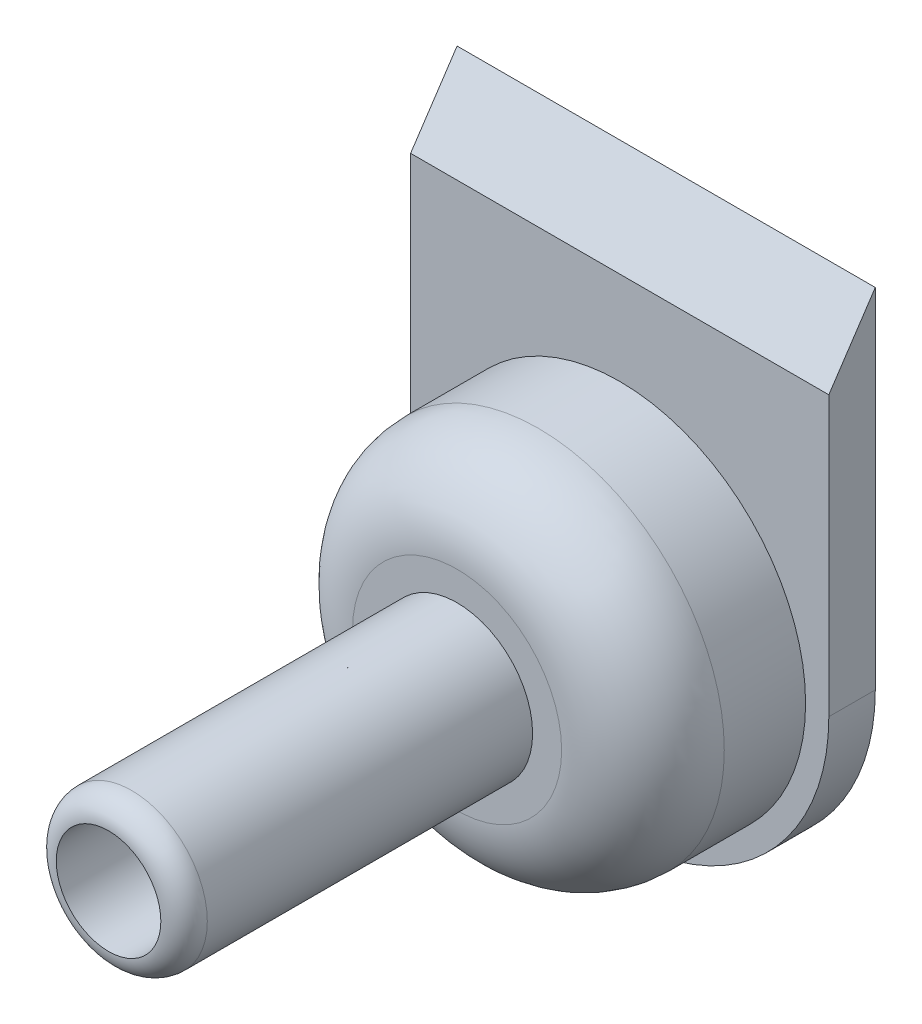
ISO-10303-21;
HEADER;
FILE_DESCRIPTION(('STEP AP214'),'2;1');
FILE_NAME('part.step','',(''),(''),'','','');
FILE_SCHEMA(('AUTOMOTIVE_DESIGN { 1 0 10303 214 1 1 1 1 }'));
ENDSEC;
DATA;
#1=APPLICATION_CONTEXT('core data for automotive mechanical design processes');
#2=APPLICATION_PROTOCOL_DEFINITION('international standard','automotive_design',2000,#1);
#3=PRODUCT_CONTEXT('',#1,'mechanical');
#4=PRODUCT('Part','Part','',(#3));
#5=PRODUCT_RELATED_PRODUCT_CATEGORY('part','',(#4));
#6=PRODUCT_DEFINITION_FORMATION('','',#4);
#7=PRODUCT_DEFINITION_CONTEXT('part definition',#1,'design');
#8=PRODUCT_DEFINITION('design','',#6,#7);
#9=PRODUCT_DEFINITION_SHAPE('','',#8);
#10=(LENGTH_UNIT() NAMED_UNIT(*) SI_UNIT(.MILLI.,.METRE.));
#11=(NAMED_UNIT(*) PLANE_ANGLE_UNIT() SI_UNIT($,.RADIAN.));
#12=(NAMED_UNIT(*) SI_UNIT($,.STERADIAN.) SOLID_ANGLE_UNIT());
#13=UNCERTAINTY_MEASURE_WITH_UNIT(LENGTH_MEASURE(1.E-05),#10,'distance_accuracy_value','');
#14=(GEOMETRIC_REPRESENTATION_CONTEXT(3) GLOBAL_UNCERTAINTY_ASSIGNED_CONTEXT((#13)) GLOBAL_UNIT_ASSIGNED_CONTEXT((#10,
#11,#12)) REPRESENTATION_CONTEXT('',''));
#15=CARTESIAN_POINT('',(0.,0.,0.));
#16=DIRECTION('',(0.,0.,1.));
#17=DIRECTION('',(1.,0.,0.));
#18=AXIS2_PLACEMENT_3D('',#15,#16,#17);
#19=CARTESIAN_POINT('',(0.,0.,30.));
#20=DIRECTION('',(0.,0.,-1.));
#21=DIRECTION('',(-1.,0.,0.));
#22=AXIS2_PLACEMENT_3D('',#19,#20,#21);
#23=CYLINDRICAL_SURFACE('',#22,6.5);
#24=CARTESIAN_POINT('',(0.,0.,28.));
#25=DIRECTION('',(0.,0.,1.));
#26=DIRECTION('',(1.,0.,0.));
#27=AXIS2_PLACEMENT_3D('',#24,#25,#26);
#28=CIRCLE('',#27,6.5);
#29=CARTESIAN_POINT('',(6.5,0.,28.));
#30=VERTEX_POINT('',#29);
#31=EDGE_CURVE('E114',#30,#30,#28,.F.);
#32=ORIENTED_EDGE('',*,*,#31,.T.);
#33=EDGE_LOOP('',(#32));
#34=FACE_BOUND('',#33,.T.);
#35=CARTESIAN_POINT('',(0.,0.,0.));
#36=DIRECTION('',(0.,0.,1.));
#37=DIRECTION('',(1.,0.,0.));
#38=AXIS2_PLACEMENT_3D('',#35,#36,#37);
#39=CIRCLE('',#38,6.5);
#40=CARTESIAN_POINT('',(6.5,0.,0.));
#41=VERTEX_POINT('',#40);
#42=EDGE_CURVE('E110',#41,#41,#39,.T.);
#43=ORIENTED_EDGE('',*,*,#42,.T.);
#44=EDGE_LOOP('',(#43));
#45=FACE_BOUND('',#44,.T.);
#46=ADVANCED_FACE('F33',(#34,#45),#23,.T.);
#47=CARTESIAN_POINT('',(0.,0.,28.));
#48=DIRECTION('',(0.,0.,1.));
#49=DIRECTION('',(1.,0.,0.));
#50=AXIS2_PLACEMENT_3D('',#47,#48,#49);
#51=TOROIDAL_SURFACE('',#50,4.5,2.);
#52=ORIENTED_EDGE('',*,*,#31,.F.);
#53=EDGE_LOOP('',(#52));
#54=FACE_BOUND('',#53,.T.);
#55=CARTESIAN_POINT('',(0.,0.,30.));
#56=DIRECTION('',(0.,0.,-1.));
#57=DIRECTION('',(-1.,0.,0.));
#58=AXIS2_PLACEMENT_3D('',#55,#56,#57);
#59=CIRCLE('',#58,4.5);
#60=CARTESIAN_POINT('',(-4.5,0.,30.));
#61=VERTEX_POINT('',#60);
#62=EDGE_CURVE('E111',#61,#61,#59,.T.);
#63=ORIENTED_EDGE('',*,*,#62,.T.);
#64=EDGE_LOOP('',(#63));
#65=FACE_BOUND('',#64,.T.);
#66=ADVANCED_FACE('F142',(#54,#65),#51,.T.);
#67=CARTESIAN_POINT('',(0.,0.,30.));
#68=DIRECTION('',(0.,0.,-1.));
#69=DIRECTION('',(-1.,0.,0.));
#70=AXIS2_PLACEMENT_3D('',#67,#68,#69);
#71=CYLINDRICAL_SURFACE('',#70,4.5);
#72=ORIENTED_EDGE('',*,*,#62,.F.);
#73=EDGE_LOOP('',(#72));
#74=FACE_BOUND('',#73,.T.);
#75=CARTESIAN_POINT('',(0.,0.,0.));
#76=DIRECTION('',(0.,0.,-1.));
#77=DIRECTION('',(-1.,0.,0.));
#78=AXIS2_PLACEMENT_3D('',#75,#76,#77);
#79=CIRCLE('',#78,4.5);
#80=CARTESIAN_POINT('',(-4.5,0.,0.));
#81=VERTEX_POINT('',#80);
#82=EDGE_CURVE('E115',#81,#81,#79,.T.);
#83=ORIENTED_EDGE('',*,*,#82,.T.);
#84=EDGE_LOOP('',(#83));
#85=FACE_BOUND('',#84,.T.);
#86=ADVANCED_FACE('F148',(#74,#85),#71,.F.);
#87=CARTESIAN_POINT('',(0.,0.,0.));
#88=DIRECTION('',(0.,0.,-1.));
#89=DIRECTION('',(-1.,0.,0.));
#90=AXIS2_PLACEMENT_3D('',#87,#88,#89);
#91=PLANE('',#90);
#92=CARTESIAN_POINT('',(0.,0.,0.));
#93=DIRECTION('',(0.,0.,-1.));
#94=DIRECTION('',(-1.,0.,0.));
#95=AXIS2_PLACEMENT_3D('',#92,#93,#94);
#96=CIRCLE('',#95,9.);
#97=CARTESIAN_POINT('',(-9.,0.,0.));
#98=VERTEX_POINT('',#97);
#99=EDGE_CURVE('E11',#98,#98,#96,.F.);
#100=ORIENTED_EDGE('',*,*,#99,.T.);
#101=EDGE_LOOP('',(#100));
#102=FACE_BOUND('',#101,.T.);
#103=ORIENTED_EDGE('',*,*,#42,.F.);
#104=EDGE_LOOP('',(#103));
#105=FACE_BOUND('',#104,.T.);
#106=ADVANCED_FACE('F139',(#102,#105),#91,.F.);
#107=CARTESIAN_POINT('',(0.,0.,-14.));
#108=DIRECTION('',(0.,0.,1.));
#109=DIRECTION('',(1.,0.,0.));
#110=AXIS2_PLACEMENT_3D('',#107,#108,#109);
#111=CYLINDRICAL_SURFACE('',#110,16.);
#112=CARTESIAN_POINT('',(0.,0.,-7.));
#113=DIRECTION('',(0.,0.,-1.));
#114=DIRECTION('',(-1.,0.,0.));
#115=AXIS2_PLACEMENT_3D('',#112,#113,#114);
#116=CIRCLE('',#115,16.);
#117=CARTESIAN_POINT('',(-16.,0.,-7.));
#118=VERTEX_POINT('',#117);
#119=EDGE_CURVE('E41',#118,#118,#116,.T.);
#120=ORIENTED_EDGE('',*,*,#119,.T.);
#121=EDGE_LOOP('',(#120));
#122=FACE_BOUND('',#121,.T.);
#123=CARTESIAN_POINT('',(0.,0.,-14.));
#124=DIRECTION('',(0.,0.,-1.));
#125=DIRECTION('',(-1.,0.,0.));
#126=AXIS2_PLACEMENT_3D('',#123,#124,#125);
#127=CIRCLE('',#126,16.);
#128=CARTESIAN_POINT('',(-16.,0.,-14.));
#129=VERTEX_POINT('',#128);
#130=EDGE_CURVE('E106',#129,#129,#127,.T.);
#131=ORIENTED_EDGE('',*,*,#130,.F.);
#132=EDGE_LOOP('',(#131));
#133=FACE_BOUND('',#132,.T.);
#134=ADVANCED_FACE('F124',(#122,#133),#111,.T.);
#135=ORIENTED_EDGE('',*,*,#82,.F.);
#136=EDGE_LOOP('',(#135));
#137=FACE_BOUND('',#136,.T.);
#138=ADVANCED_FACE('F129',(#137),#91,.F.);
#139=CARTESIAN_POINT('',(0.,0.,-7.));
#140=DIRECTION('',(0.,0.,-1.));
#141=DIRECTION('',(-1.,0.,0.));
#142=AXIS2_PLACEMENT_3D('',#139,#140,#141);
#143=TOROIDAL_SURFACE('',#142,9.,7.);
#144=ORIENTED_EDGE('',*,*,#99,.F.);
#145=EDGE_LOOP('',(#144));
#146=FACE_BOUND('',#145,.T.);
#147=ORIENTED_EDGE('',*,*,#119,.F.);
#148=EDGE_LOOP('',(#147));
#149=FACE_BOUND('',#148,.T.);
#150=ADVANCED_FACE('F35',(#146,#149),#143,.T.);
#151=CARTESIAN_POINT('',(0.,0.,-18.));
#152=DIRECTION('',(0.,0.,1.));
#153=DIRECTION('',(1.,0.,0.));
#154=AXIS2_PLACEMENT_3D('',#151,#152,#153);
#155=CYLINDRICAL_SURFACE('',#154,18.);
#156=CARTESIAN_POINT('',(0.,0.,-18.));
#157=DIRECTION('',(0.,0.,-1.));
#158=DIRECTION('',(-1.,0.,0.));
#159=AXIS2_PLACEMENT_3D('',#156,#157,#158);
#160=CIRCLE('',#159,18.);
#161=CARTESIAN_POINT('',(18.,0.,-18.));
#162=VERTEX_POINT('',#161);
#163=CARTESIAN_POINT('',(-18.,0.,-18.));
#164=VERTEX_POINT('',#163);
#165=EDGE_CURVE('E48',#162,#164,#160,.T.);
#166=ORIENTED_EDGE('',*,*,#165,.F.);
#167=DIRECTION('',(0.,0.,1.));
#168=VECTOR('',#167,1.);
#169=CARTESIAN_POINT('',(18.,0.,-18.));
#170=LINE('',#169,#168);
#171=CARTESIAN_POINT('',(18.,0.,-14.));
#172=VERTEX_POINT('',#171);
#173=EDGE_CURVE('E103',#172,#162,#170,.F.);
#174=ORIENTED_EDGE('',*,*,#173,.F.);
#175=CARTESIAN_POINT('',(0.,0.,-14.));
#176=DIRECTION('',(0.,0.,-1.));
#177=DIRECTION('',(-1.,0.,0.));
#178=AXIS2_PLACEMENT_3D('',#175,#176,#177);
#179=CIRCLE('',#178,18.);
#180=CARTESIAN_POINT('',(-18.,0.,-14.));
#181=VERTEX_POINT('',#180);
#182=EDGE_CURVE('E94',#172,#181,#179,.T.);
#183=ORIENTED_EDGE('',*,*,#182,.T.);
#184=DIRECTION('',(0.,0.,1.));
#185=VECTOR('',#184,1.);
#186=CARTESIAN_POINT('',(-18.,0.,-18.));
#187=LINE('',#186,#185);
#188=EDGE_CURVE('E53',#181,#164,#187,.F.);
#189=ORIENTED_EDGE('',*,*,#188,.T.);
#190=EDGE_LOOP('',(#166,#174,#183,#189));
#191=FACE_BOUND('',#190,.T.);
#192=ADVANCED_FACE('F128',(#191),#155,.T.);
#193=CARTESIAN_POINT('',(0.,0.,-18.));
#194=DIRECTION('',(0.,0.,-1.));
#195=DIRECTION('',(-1.,0.,0.));
#196=AXIS2_PLACEMENT_3D('',#193,#194,#195);
#197=PLANE('',#196);
#198=ORIENTED_EDGE('',*,*,#165,.T.);
#199=DIRECTION('',(0.,1.,0.));
#200=VECTOR('',#199,1.);
#201=CARTESIAN_POINT('',(-18.,-18.002,-18.));
#202=LINE('',#201,#200);
#203=CARTESIAN_POINT('',(-18.,30.,-18.));
#204=VERTEX_POINT('',#203);
#205=EDGE_CURVE('E97',#164,#204,#202,.T.);
#206=ORIENTED_EDGE('',*,*,#205,.T.);
#207=DIRECTION('',(-1.,0.,0.));
#208=VECTOR('',#207,1.);
#209=CARTESIAN_POINT('',(18.,30.,-18.));
#210=LINE('',#209,#208);
#211=CARTESIAN_POINT('',(18.,30.,-18.));
#212=VERTEX_POINT('',#211);
#213=EDGE_CURVE('E83',#212,#204,#210,.T.);
#214=ORIENTED_EDGE('',*,*,#213,.F.);
#215=DIRECTION('',(0.,1.,0.));
#216=VECTOR('',#215,1.);
#217=CARTESIAN_POINT('',(18.,-18.002,-18.));
#218=LINE('',#217,#216);
#219=EDGE_CURVE('E90',#162,#212,#218,.T.);
#220=ORIENTED_EDGE('',*,*,#219,.F.);
#221=EDGE_LOOP('',(#198,#206,#214,#220));
#222=FACE_BOUND('',#221,.T.);
#223=ADVANCED_FACE('F135',(#222),#197,.T.);
#224=CARTESIAN_POINT('',(0.,0.,-14.));
#225=DIRECTION('',(0.,0.,-1.));
#226=DIRECTION('',(-1.,0.,0.));
#227=AXIS2_PLACEMENT_3D('',#224,#225,#226);
#228=PLANE('',#227);
#229=ORIENTED_EDGE('',*,*,#130,.T.);
#230=EDGE_LOOP('',(#229));
#231=FACE_BOUND('',#230,.T.);
#232=DIRECTION('',(0.,1.,0.));
#233=VECTOR('',#232,1.);
#234=CARTESIAN_POINT('',(18.,-18.002,-14.));
#235=LINE('',#234,#233);
#236=CARTESIAN_POINT('',(18.,24.,-14.));
#237=VERTEX_POINT('',#236);
#238=EDGE_CURVE('E88',#172,#237,#235,.T.);
#239=ORIENTED_EDGE('',*,*,#238,.T.);
#240=DIRECTION('',(1.,0.,0.));
#241=VECTOR('',#240,1.);
#242=CARTESIAN_POINT('',(-18.001,24.,-14.));
#243=LINE('',#242,#241);
#244=CARTESIAN_POINT('',(-18.,24.,-14.));
#245=VERTEX_POINT('',#244);
#246=EDGE_CURVE('E72',#245,#237,#243,.T.);
#247=ORIENTED_EDGE('',*,*,#246,.F.);
#248=DIRECTION('',(0.,1.,0.));
#249=VECTOR('',#248,1.);
#250=CARTESIAN_POINT('',(-18.,-18.002,-14.));
#251=LINE('',#250,#249);
#252=EDGE_CURVE('E95',#181,#245,#251,.T.);
#253=ORIENTED_EDGE('',*,*,#252,.F.);
#254=ORIENTED_EDGE('',*,*,#182,.F.);
#255=EDGE_LOOP('',(#239,#247,#253,#254));
#256=FACE_BOUND('',#255,.T.);
#257=ADVANCED_FACE('F93',(#231,#256),#228,.F.);
#258=CARTESIAN_POINT('',(18.,-18.002,-14.));
#259=DIRECTION('',(1.,0.,0.));
#260=DIRECTION('',(0.,0.,-1.));
#261=AXIS2_PLACEMENT_3D('',#258,#259,#260);
#262=PLANE('',#261);
#263=DIRECTION('',(0.,0.832050294337844,-0.554700196225229));
#264=VECTOR('',#263,1.);
#265=CARTESIAN_POINT('',(18.,30.,-18.));
#266=LINE('',#265,#264);
#267=EDGE_CURVE('E75',#237,#212,#266,.T.);
#268=ORIENTED_EDGE('',*,*,#267,.F.);
#269=ORIENTED_EDGE('',*,*,#238,.F.);
#270=ORIENTED_EDGE('',*,*,#173,.T.);
#271=ORIENTED_EDGE('',*,*,#219,.T.);
#272=EDGE_LOOP('',(#268,#269,#270,#271));
#273=FACE_BOUND('',#272,.T.);
#274=ADVANCED_FACE('F87',(#273),#262,.T.);
#275=CARTESIAN_POINT('',(-18.,-18.002,-14.));
#276=DIRECTION('',(-1.,0.,0.));
#277=DIRECTION('',(0.,0.,1.));
#278=AXIS2_PLACEMENT_3D('',#275,#276,#277);
#279=PLANE('',#278);
#280=DIRECTION('',(0.,0.832050294337844,-0.554700196225229));
#281=VECTOR('',#280,1.);
#282=CARTESIAN_POINT('',(-18.,30.,-18.));
#283=LINE('',#282,#281);
#284=EDGE_CURVE('E78',#245,#204,#283,.T.);
#285=ORIENTED_EDGE('',*,*,#284,.T.);
#286=ORIENTED_EDGE('',*,*,#205,.F.);
#287=ORIENTED_EDGE('',*,*,#188,.F.);
#288=ORIENTED_EDGE('',*,*,#252,.T.);
#289=EDGE_LOOP('',(#285,#286,#287,#288));
#290=FACE_BOUND('',#289,.T.);
#291=ADVANCED_FACE('F162',(#290),#279,.T.);
#292=CARTESIAN_POINT('',(-18.001,30.,-18.));
#293=DIRECTION('',(0.,-0.554700196225229,-0.832050294337843));
#294=DIRECTION('',(0.,0.832050294337843,-0.554700196225229));
#295=AXIS2_PLACEMENT_3D('',#292,#293,#294);
#296=PLANE('',#295);
#297=ORIENTED_EDGE('',*,*,#246,.T.);
#298=ORIENTED_EDGE('',*,*,#267,.T.);
#299=ORIENTED_EDGE('',*,*,#213,.T.);
#300=ORIENTED_EDGE('',*,*,#284,.F.);
#301=EDGE_LOOP('',(#297,#298,#299,#300));
#302=FACE_BOUND('',#301,.T.);
#303=ADVANCED_FACE('F74',(#302),#296,.F.);
#304=CLOSED_SHELL('',(#46,#66,#86,#106,#134,#138,#150,#192,#223,#257,#274,#291,#303));
#305=MANIFOLD_SOLID_BREP('B2',#304);
#306=ADVANCED_BREP_SHAPE_REPRESENTATION('',(#18,#305),#14);
#307=SHAPE_DEFINITION_REPRESENTATION(#9,#306);
ENDSEC;
END-ISO-10303-21;
